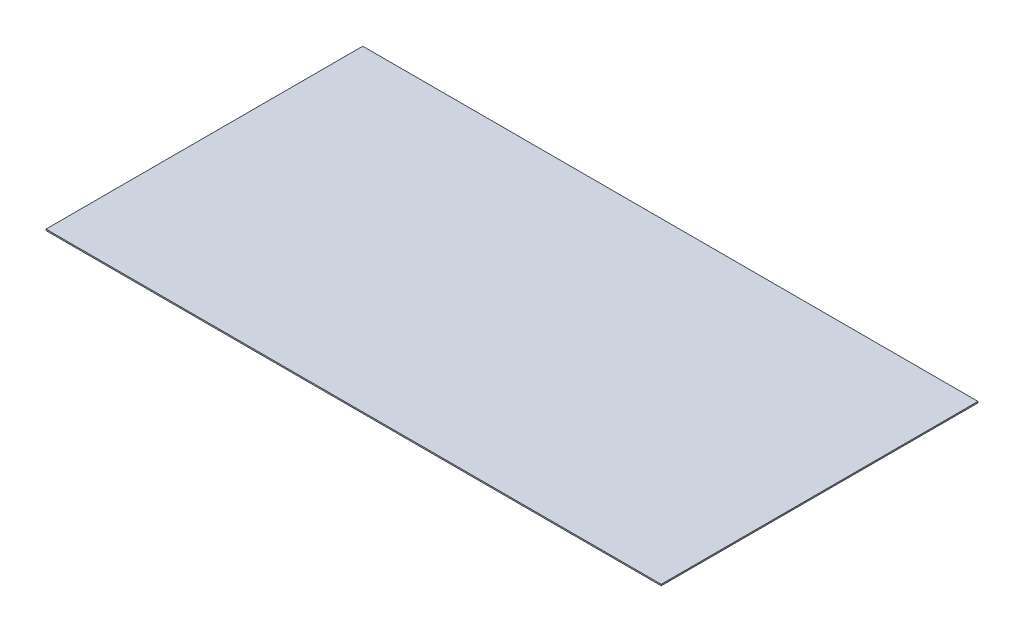
ISO-10303-21;
HEADER;
FILE_DESCRIPTION(('STEP AP214'),'2;1');
FILE_NAME('part.step','',(''),(''),'','','');
FILE_SCHEMA(('AUTOMOTIVE_DESIGN { 1 0 10303 214 1 1 1 1 }'));
ENDSEC;
DATA;
#1=APPLICATION_CONTEXT('core data for automotive mechanical design processes');
#2=APPLICATION_PROTOCOL_DEFINITION('international standard','automotive_design',2000,#1);
#3=PRODUCT_CONTEXT('',#1,'mechanical');
#4=PRODUCT('Part','Part','',(#3));
#5=PRODUCT_RELATED_PRODUCT_CATEGORY('part','',(#4));
#6=PRODUCT_DEFINITION_FORMATION('','',#4);
#7=PRODUCT_DEFINITION_CONTEXT('part definition',#1,'design');
#8=PRODUCT_DEFINITION('design','',#6,#7);
#9=PRODUCT_DEFINITION_SHAPE('','',#8);
#10=(LENGTH_UNIT() NAMED_UNIT(*) SI_UNIT(.MILLI.,.METRE.));
#11=(NAMED_UNIT(*) PLANE_ANGLE_UNIT() SI_UNIT($,.RADIAN.));
#12=(NAMED_UNIT(*) SI_UNIT($,.STERADIAN.) SOLID_ANGLE_UNIT());
#13=UNCERTAINTY_MEASURE_WITH_UNIT(LENGTH_MEASURE(1.E-05),#10,'distance_accuracy_value','');
#14=(GEOMETRIC_REPRESENTATION_CONTEXT(3) GLOBAL_UNCERTAINTY_ASSIGNED_CONTEXT((#13)) GLOBAL_UNIT_ASSIGNED_CONTEXT((#10,
#11,#12)) REPRESENTATION_CONTEXT('',''));
#15=CARTESIAN_POINT('',(0.,0.,0.));
#16=DIRECTION('',(0.,0.,1.));
#17=DIRECTION('',(1.,0.,0.));
#18=AXIS2_PLACEMENT_3D('',#15,#16,#17);
#19=CARTESIAN_POINT('',(296.,0.,0.));
#20=DIRECTION('',(0.,0.,-1.));
#21=DIRECTION('',(-1.,0.,0.));
#22=AXIS2_PLACEMENT_3D('',#19,#20,#21);
#23=PLANE('',#22);
#24=DIRECTION('',(0.,-1.,0.));
#25=VECTOR('',#24,1.);
#26=CARTESIAN_POINT('',(0.,0.,0.));
#27=LINE('',#26,#25);
#28=CARTESIAN_POINT('',(0.,0.635,0.));
#29=VERTEX_POINT('',#28);
#30=CARTESIAN_POINT('',(0.,0.,0.));
#31=VERTEX_POINT('',#30);
#32=EDGE_CURVE('E111',#29,#31,#27,.T.);
#33=ORIENTED_EDGE('',*,*,#32,.T.);
#34=DIRECTION('',(-1.,0.,0.));
#35=VECTOR('',#34,1.);
#36=CARTESIAN_POINT('',(296.,0.,0.));
#37=LINE('',#36,#35);
#38=CARTESIAN_POINT('',(296.,0.,0.));
#39=VERTEX_POINT('',#38);
#40=EDGE_CURVE('E12',#39,#31,#37,.T.);
#41=ORIENTED_EDGE('',*,*,#40,.F.);
#42=DIRECTION('',(0.,-1.,0.));
#43=VECTOR('',#42,1.);
#44=CARTESIAN_POINT('',(296.,0.,0.));
#45=LINE('',#44,#43);
#46=CARTESIAN_POINT('',(296.,0.635,0.));
#47=VERTEX_POINT('',#46);
#48=EDGE_CURVE('E100',#47,#39,#45,.T.);
#49=ORIENTED_EDGE('',*,*,#48,.F.);
#50=DIRECTION('',(-1.,0.,0.));
#51=VECTOR('',#50,1.);
#52=CARTESIAN_POINT('',(296.,0.635,0.));
#53=LINE('',#52,#51);
#54=EDGE_CURVE('E108',#47,#29,#53,.T.);
#55=ORIENTED_EDGE('',*,*,#54,.T.);
#56=EDGE_LOOP('',(#33,#41,#49,#55));
#57=FACE_BOUND('',#56,.T.);
#58=ADVANCED_FACE('F49',(#57),#23,.F.);
#59=CARTESIAN_POINT('',(296.,0.,0.));
#60=DIRECTION('',(0.,1.,0.));
#61=DIRECTION('',(0.,0.,1.));
#62=AXIS2_PLACEMENT_3D('',#59,#60,#61);
#63=PLANE('',#62);
#64=DIRECTION('',(0.,0.,-1.));
#65=VECTOR('',#64,1.);
#66=CARTESIAN_POINT('',(0.,0.,0.));
#67=LINE('',#66,#65);
#68=CARTESIAN_POINT('',(0.,0.,-152.4));
#69=VERTEX_POINT('',#68);
#70=EDGE_CURVE('E104',#31,#69,#67,.T.);
#71=ORIENTED_EDGE('',*,*,#70,.T.);
#72=DIRECTION('',(-1.,0.,0.));
#73=VECTOR('',#72,1.);
#74=CARTESIAN_POINT('',(296.,0.,-152.4));
#75=LINE('',#74,#73);
#76=CARTESIAN_POINT('',(296.,0.,-152.4));
#77=VERTEX_POINT('',#76);
#78=EDGE_CURVE('E57',#77,#69,#75,.T.);
#79=ORIENTED_EDGE('',*,*,#78,.F.);
#80=DIRECTION('',(0.,0.,-1.));
#81=VECTOR('',#80,1.);
#82=CARTESIAN_POINT('',(296.,0.,0.));
#83=LINE('',#82,#81);
#84=EDGE_CURVE('E95',#39,#77,#83,.T.);
#85=ORIENTED_EDGE('',*,*,#84,.F.);
#86=ORIENTED_EDGE('',*,*,#40,.T.);
#87=EDGE_LOOP('',(#71,#79,#85,#86));
#88=FACE_BOUND('',#87,.T.);
#89=ADVANCED_FACE('F103',(#88),#63,.F.);
#90=CARTESIAN_POINT('',(296.,0.,-152.4));
#91=DIRECTION('',(0.,0.,1.));
#92=DIRECTION('',(1.,0.,0.));
#93=AXIS2_PLACEMENT_3D('',#90,#91,#92);
#94=PLANE('',#93);
#95=DIRECTION('',(0.,1.,0.));
#96=VECTOR('',#95,1.);
#97=CARTESIAN_POINT('',(0.,0.,-152.4));
#98=LINE('',#97,#96);
#99=CARTESIAN_POINT('',(0.,0.635,-152.4));
#100=VERTEX_POINT('',#99);
#101=EDGE_CURVE('E82',#69,#100,#98,.T.);
#102=ORIENTED_EDGE('',*,*,#101,.T.);
#103=DIRECTION('',(-1.,0.,0.));
#104=VECTOR('',#103,1.);
#105=CARTESIAN_POINT('',(296.,0.635,-152.4));
#106=LINE('',#105,#104);
#107=CARTESIAN_POINT('',(296.,0.635,-152.4));
#108=VERTEX_POINT('',#107);
#109=EDGE_CURVE('E105',#108,#100,#106,.T.);
#110=ORIENTED_EDGE('',*,*,#109,.F.);
#111=DIRECTION('',(0.,1.,0.));
#112=VECTOR('',#111,1.);
#113=CARTESIAN_POINT('',(296.,0.,-152.4));
#114=LINE('',#113,#112);
#115=EDGE_CURVE('E98',#77,#108,#114,.T.);
#116=ORIENTED_EDGE('',*,*,#115,.F.);
#117=ORIENTED_EDGE('',*,*,#78,.T.);
#118=EDGE_LOOP('',(#102,#110,#116,#117));
#119=FACE_BOUND('',#118,.T.);
#120=ADVANCED_FACE('F106',(#119),#94,.F.);
#121=CARTESIAN_POINT('',(296.,0.635,0.));
#122=DIRECTION('',(0.,-1.,0.));
#123=DIRECTION('',(0.,0.,-1.));
#124=AXIS2_PLACEMENT_3D('',#121,#122,#123);
#125=PLANE('',#124);
#126=DIRECTION('',(0.,0.,1.));
#127=VECTOR('',#126,1.);
#128=CARTESIAN_POINT('',(0.,0.635,0.));
#129=LINE('',#128,#127);
#130=EDGE_CURVE('E88',#100,#29,#129,.T.);
#131=ORIENTED_EDGE('',*,*,#130,.T.);
#132=ORIENTED_EDGE('',*,*,#54,.F.);
#133=DIRECTION('',(0.,0.,1.));
#134=VECTOR('',#133,1.);
#135=CARTESIAN_POINT('',(296.,0.635,0.));
#136=LINE('',#135,#134);
#137=EDGE_CURVE('E65',#108,#47,#136,.T.);
#138=ORIENTED_EDGE('',*,*,#137,.F.);
#139=ORIENTED_EDGE('',*,*,#109,.T.);
#140=EDGE_LOOP('',(#131,#132,#138,#139));
#141=FACE_BOUND('',#140,.T.);
#142=ADVANCED_FACE('F118',(#141),#125,.F.);
#143=CARTESIAN_POINT('',(296.,0.,0.));
#144=DIRECTION('',(-1.,0.,0.));
#145=DIRECTION('',(0.,0.,1.));
#146=AXIS2_PLACEMENT_3D('',#143,#144,#145);
#147=PLANE('',#146);
#148=ORIENTED_EDGE('',*,*,#48,.T.);
#149=ORIENTED_EDGE('',*,*,#84,.T.);
#150=ORIENTED_EDGE('',*,*,#115,.T.);
#151=ORIENTED_EDGE('',*,*,#137,.T.);
#152=EDGE_LOOP('',(#148,#149,#150,#151));
#153=FACE_BOUND('',#152,.T.);
#154=ADVANCED_FACE('F96',(#153),#147,.F.);
#155=CARTESIAN_POINT('',(0.,0.,0.));
#156=DIRECTION('',(-1.,0.,0.));
#157=DIRECTION('',(0.,0.,1.));
#158=AXIS2_PLACEMENT_3D('',#155,#156,#157);
#159=PLANE('',#158);
#160=ORIENTED_EDGE('',*,*,#32,.F.);
#161=ORIENTED_EDGE('',*,*,#130,.F.);
#162=ORIENTED_EDGE('',*,*,#101,.F.);
#163=ORIENTED_EDGE('',*,*,#70,.F.);
#164=EDGE_LOOP('',(#160,#161,#162,#163));
#165=FACE_BOUND('',#164,.T.);
#166=ADVANCED_FACE('F121',(#165),#159,.T.);
#167=CLOSED_SHELL('',(#58,#89,#120,#142,#154,#166));
#168=MANIFOLD_SOLID_BREP('B2',#167);
#169=ADVANCED_BREP_SHAPE_REPRESENTATION('',(#18,#168),#14);
#170=SHAPE_DEFINITION_REPRESENTATION(#9,#169);
ENDSEC;
END-ISO-10303-21;
